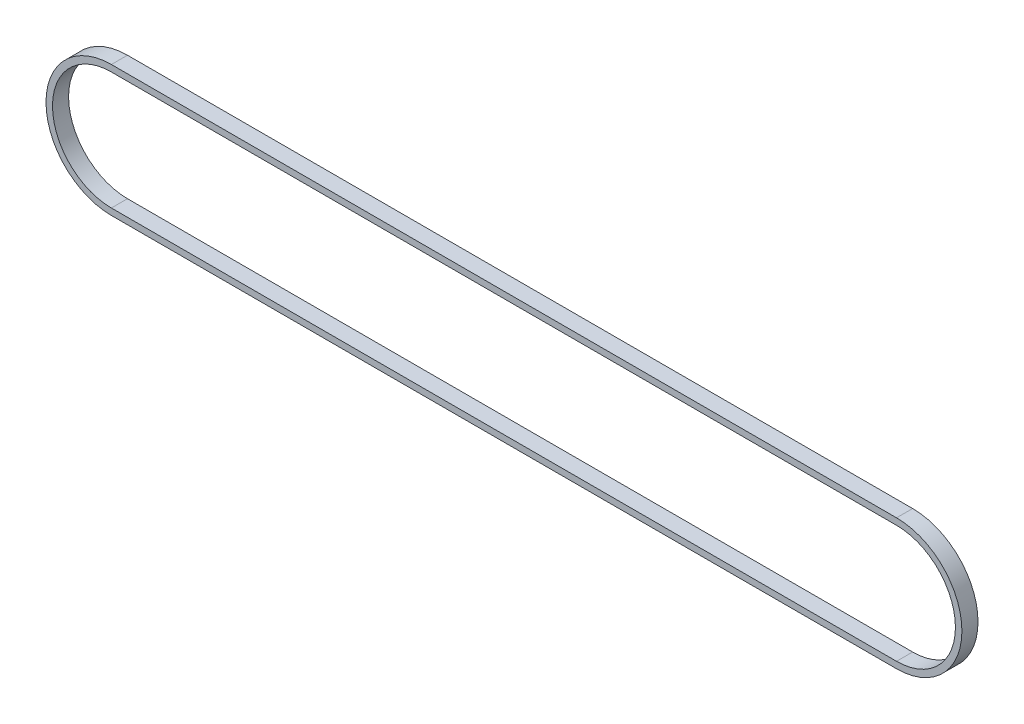
ISO-10303-21;
HEADER;
FILE_DESCRIPTION(('STEP AP214'),'2;1');
FILE_NAME('part.step','',(''),(''),'','','');
FILE_SCHEMA(('AUTOMOTIVE_DESIGN { 1 0 10303 214 1 1 1 1 }'));
ENDSEC;
DATA;
#1=APPLICATION_CONTEXT('core data for automotive mechanical design processes');
#2=APPLICATION_PROTOCOL_DEFINITION('international standard','automotive_design',2000,#1);
#3=PRODUCT_CONTEXT('',#1,'mechanical');
#4=PRODUCT('Part','Part','',(#3));
#5=PRODUCT_RELATED_PRODUCT_CATEGORY('part','',(#4));
#6=PRODUCT_DEFINITION_FORMATION('','',#4);
#7=PRODUCT_DEFINITION_CONTEXT('part definition',#1,'design');
#8=PRODUCT_DEFINITION('design','',#6,#7);
#9=PRODUCT_DEFINITION_SHAPE('','',#8);
#10=(LENGTH_UNIT() NAMED_UNIT(*) SI_UNIT(.MILLI.,.METRE.));
#11=(NAMED_UNIT(*) PLANE_ANGLE_UNIT() SI_UNIT($,.RADIAN.));
#12=(NAMED_UNIT(*) SI_UNIT($,.STERADIAN.) SOLID_ANGLE_UNIT());
#13=UNCERTAINTY_MEASURE_WITH_UNIT(LENGTH_MEASURE(1.E-05),#10,'distance_accuracy_value','');
#14=(GEOMETRIC_REPRESENTATION_CONTEXT(3) GLOBAL_UNCERTAINTY_ASSIGNED_CONTEXT((#13)) GLOBAL_UNIT_ASSIGNED_CONTEXT((#10,
#11,#12)) REPRESENTATION_CONTEXT('',''));
#15=CARTESIAN_POINT('',(0.,0.,0.));
#16=DIRECTION('',(0.,0.,1.));
#17=DIRECTION('',(1.,0.,0.));
#18=AXIS2_PLACEMENT_3D('',#15,#16,#17);
#19=CARTESIAN_POINT('',(8362.99467657725,-214.725030648158,82.));
#20=DIRECTION('',(0.,0.,1.));
#21=DIRECTION('',(1.,0.,0.));
#22=AXIS2_PLACEMENT_3D('',#19,#20,#21);
#23=PLANE('',#22);
#24=CARTESIAN_POINT('',(8362.99467657725,-214.725030648158,82.));
#25=DIRECTION('',(0.,0.,1.));
#26=DIRECTION('',(1.,0.,0.));
#27=AXIS2_PLACEMENT_3D('',#24,#25,#26);
#28=CIRCLE('',#27,333.06401102603);
#29=CARTESIAN_POINT('',(8362.99467657725,-547.789041674188,82.));
#30=VERTEX_POINT('',#29);
#31=CARTESIAN_POINT('',(8362.99467657725,118.338980377872,82.));
#32=VERTEX_POINT('',#31);
#33=EDGE_CURVE('E134',#30,#32,#28,.T.);
#34=ORIENTED_EDGE('',*,*,#33,.T.);
#35=DIRECTION('',(-1.,0.,0.));
#36=VECTOR('',#35,1.);
#37=CARTESIAN_POINT('',(8362.99467657725,118.338980377872,82.));
#38=LINE('',#37,#36);
#39=CARTESIAN_POINT('',(4362.99467657725,118.338980377871,82.));
#40=VERTEX_POINT('',#39);
#41=EDGE_CURVE('E137',#32,#40,#38,.T.);
#42=ORIENTED_EDGE('',*,*,#41,.T.);
#43=CARTESIAN_POINT('',(4362.99467657725,-214.725030648158,82.));
#44=DIRECTION('',(0.,0.,1.));
#45=DIRECTION('',(1.,0.,0.));
#46=AXIS2_PLACEMENT_3D('',#43,#44,#45);
#47=CIRCLE('',#46,333.064011026029);
#48=CARTESIAN_POINT('',(4362.99467657725,-547.789041674187,82.));
#49=VERTEX_POINT('',#48);
#50=EDGE_CURVE('E140',#40,#49,#47,.T.);
#51=ORIENTED_EDGE('',*,*,#50,.T.);
#52=DIRECTION('',(1.,0.,0.));
#53=VECTOR('',#52,1.);
#54=CARTESIAN_POINT('',(8362.99467657725,-547.789041674188,82.));
#55=LINE('',#54,#53);
#56=EDGE_CURVE('E142',#49,#30,#55,.T.);
#57=ORIENTED_EDGE('',*,*,#56,.T.);
#58=EDGE_LOOP('',(#34,#42,#51,#57));
#59=FACE_BOUND('',#58,.T.);
#60=DIRECTION('',(1.,0.,0.));
#61=VECTOR('',#60,1.);
#62=CARTESIAN_POINT('',(4362.99467657725,-514.725030648158,82.));
#63=LINE('',#62,#61);
#64=CARTESIAN_POINT('',(4362.99467657725,-514.725030648158,82.));
#65=VERTEX_POINT('',#64);
#66=CARTESIAN_POINT('',(8362.99467657725,-514.725030648158,82.));
#67=VERTEX_POINT('',#66);
#68=EDGE_CURVE('E106',#65,#67,#63,.T.);
#69=ORIENTED_EDGE('',*,*,#68,.F.);
#70=CARTESIAN_POINT('',(4362.99467657725,-214.725030648158,82.));
#71=DIRECTION('',(0.,0.,1.));
#72=DIRECTION('',(1.,0.,0.));
#73=AXIS2_PLACEMENT_3D('',#70,#71,#72);
#74=CIRCLE('',#73,300.);
#75=CARTESIAN_POINT('',(4362.99467657725,85.2749693518419,82.));
#76=VERTEX_POINT('',#75);
#77=EDGE_CURVE('E98',#76,#65,#74,.T.);
#78=ORIENTED_EDGE('',*,*,#77,.F.);
#79=DIRECTION('',(-1.,0.,0.));
#80=VECTOR('',#79,1.);
#81=CARTESIAN_POINT('',(4362.99467657725,85.2749693518419,82.));
#82=LINE('',#81,#80);
#83=CARTESIAN_POINT('',(8362.99467657725,85.2749693518419,82.));
#84=VERTEX_POINT('',#83);
#85=EDGE_CURVE('E120',#84,#76,#82,.T.);
#86=ORIENTED_EDGE('',*,*,#85,.F.);
#87=CARTESIAN_POINT('',(8362.99467657725,-214.725030648158,82.));
#88=DIRECTION('',(0.,0.,1.));
#89=DIRECTION('',(1.,0.,0.));
#90=AXIS2_PLACEMENT_3D('',#87,#88,#89);
#91=CIRCLE('',#90,300.);
#92=EDGE_CURVE('E118',#67,#84,#91,.T.);
#93=ORIENTED_EDGE('',*,*,#92,.F.);
#94=EDGE_LOOP('',(#69,#78,#86,#93));
#95=FACE_BOUND('',#94,.T.);
#96=ADVANCED_FACE('F33',(#59,#95),#23,.T.);
#97=CARTESIAN_POINT('',(8362.99467657725,-214.725030648158,0.));
#98=DIRECTION('',(0.,0.,1.));
#99=DIRECTION('',(1.,0.,0.));
#100=AXIS2_PLACEMENT_3D('',#97,#98,#99);
#101=PLANE('',#100);
#102=CARTESIAN_POINT('',(8362.99467657725,-214.725030648158,0.));
#103=DIRECTION('',(0.,0.,1.));
#104=DIRECTION('',(1.,0.,0.));
#105=AXIS2_PLACEMENT_3D('',#102,#103,#104);
#106=CIRCLE('',#105,333.06401102603);
#107=CARTESIAN_POINT('',(8362.99467657725,-547.789041674188,0.));
#108=VERTEX_POINT('',#107);
#109=CARTESIAN_POINT('',(8362.99467657725,118.338980377872,0.));
#110=VERTEX_POINT('',#109);
#111=EDGE_CURVE('E114',#108,#110,#106,.T.);
#112=ORIENTED_EDGE('',*,*,#111,.F.);
#113=DIRECTION('',(1.,0.,0.));
#114=VECTOR('',#113,1.);
#115=CARTESIAN_POINT('',(8362.99467657725,-547.789041674188,0.));
#116=LINE('',#115,#114);
#117=CARTESIAN_POINT('',(4362.99467657725,-547.789041674187,0.));
#118=VERTEX_POINT('',#117);
#119=EDGE_CURVE('E138',#118,#108,#116,.T.);
#120=ORIENTED_EDGE('',*,*,#119,.F.);
#121=CARTESIAN_POINT('',(4362.99467657725,-214.725030648158,0.));
#122=DIRECTION('',(0.,0.,1.));
#123=DIRECTION('',(1.,0.,0.));
#124=AXIS2_PLACEMENT_3D('',#121,#122,#123);
#125=CIRCLE('',#124,333.064011026029);
#126=CARTESIAN_POINT('',(4362.99467657725,118.338980377871,0.));
#127=VERTEX_POINT('',#126);
#128=EDGE_CURVE('E149',#127,#118,#125,.T.);
#129=ORIENTED_EDGE('',*,*,#128,.F.);
#130=DIRECTION('',(-1.,0.,0.));
#131=VECTOR('',#130,1.);
#132=CARTESIAN_POINT('',(8362.99467657725,118.338980377872,0.));
#133=LINE('',#132,#131);
#134=EDGE_CURVE('E147',#110,#127,#133,.T.);
#135=ORIENTED_EDGE('',*,*,#134,.F.);
#136=EDGE_LOOP('',(#112,#120,#129,#135));
#137=FACE_BOUND('',#136,.T.);
#138=CARTESIAN_POINT('',(4362.99467657725,-214.725030648158,0.));
#139=DIRECTION('',(0.,0.,1.));
#140=DIRECTION('',(1.,0.,0.));
#141=AXIS2_PLACEMENT_3D('',#138,#139,#140);
#142=CIRCLE('',#141,300.);
#143=CARTESIAN_POINT('',(4362.99467657725,85.2749693518419,0.));
#144=VERTEX_POINT('',#143);
#145=CARTESIAN_POINT('',(4362.99467657725,-514.725030648158,0.));
#146=VERTEX_POINT('',#145);
#147=EDGE_CURVE('E56',#144,#146,#142,.T.);
#148=ORIENTED_EDGE('',*,*,#147,.T.);
#149=DIRECTION('',(1.,0.,0.));
#150=VECTOR('',#149,1.);
#151=CARTESIAN_POINT('',(4362.99467657725,-514.725030648158,0.));
#152=LINE('',#151,#150);
#153=CARTESIAN_POINT('',(8362.99467657725,-514.725030648158,0.));
#154=VERTEX_POINT('',#153);
#155=EDGE_CURVE('E113',#146,#154,#152,.T.);
#156=ORIENTED_EDGE('',*,*,#155,.T.);
#157=CARTESIAN_POINT('',(8362.99467657725,-214.725030648158,0.));
#158=DIRECTION('',(0.,0.,1.));
#159=DIRECTION('',(1.,0.,0.));
#160=AXIS2_PLACEMENT_3D('',#157,#158,#159);
#161=CIRCLE('',#160,300.);
#162=CARTESIAN_POINT('',(8362.99467657725,85.2749693518419,0.));
#163=VERTEX_POINT('',#162);
#164=EDGE_CURVE('E126',#154,#163,#161,.T.);
#165=ORIENTED_EDGE('',*,*,#164,.T.);
#166=DIRECTION('',(-1.,0.,0.));
#167=VECTOR('',#166,1.);
#168=CARTESIAN_POINT('',(4362.99467657725,85.2749693518419,0.));
#169=LINE('',#168,#167);
#170=EDGE_CURVE('E107',#163,#144,#169,.T.);
#171=ORIENTED_EDGE('',*,*,#170,.T.);
#172=EDGE_LOOP('',(#148,#156,#165,#171));
#173=FACE_BOUND('',#172,.T.);
#174=ADVANCED_FACE('F167',(#137,#173),#101,.F.);
#175=CARTESIAN_POINT('',(8362.99467657725,-214.725030648158,82.));
#176=DIRECTION('',(0.,0.,-1.));
#177=DIRECTION('',(-1.,0.,0.));
#178=AXIS2_PLACEMENT_3D('',#175,#176,#177);
#179=CYLINDRICAL_SURFACE('',#178,333.06401102603);
#180=ORIENTED_EDGE('',*,*,#111,.T.);
#181=DIRECTION('',(0.,0.,-1.));
#182=VECTOR('',#181,1.);
#183=CARTESIAN_POINT('',(8362.99467657725,118.338980377872,82.));
#184=LINE('',#183,#182);
#185=EDGE_CURVE('E11',#32,#110,#184,.T.);
#186=ORIENTED_EDGE('',*,*,#185,.F.);
#187=ORIENTED_EDGE('',*,*,#33,.F.);
#188=DIRECTION('',(0.,0.,-1.));
#189=VECTOR('',#188,1.);
#190=CARTESIAN_POINT('',(8362.99467657725,-547.789041674188,82.));
#191=LINE('',#190,#189);
#192=EDGE_CURVE('E144',#30,#108,#191,.T.);
#193=ORIENTED_EDGE('',*,*,#192,.T.);
#194=EDGE_LOOP('',(#180,#186,#187,#193));
#195=FACE_BOUND('',#194,.T.);
#196=ADVANCED_FACE('F35',(#195),#179,.T.);
#197=CARTESIAN_POINT('',(8362.99467657725,118.338980377872,82.));
#198=DIRECTION('',(0.,-1.,0.));
#199=DIRECTION('',(1.,0.,0.));
#200=AXIS2_PLACEMENT_3D('',#197,#198,#199);
#201=PLANE('',#200);
#202=ORIENTED_EDGE('',*,*,#134,.T.);
#203=DIRECTION('',(0.,0.,-1.));
#204=VECTOR('',#203,1.);
#205=CARTESIAN_POINT('',(4362.99467657725,118.338980377871,82.));
#206=LINE('',#205,#204);
#207=EDGE_CURVE('E41',#40,#127,#206,.T.);
#208=ORIENTED_EDGE('',*,*,#207,.F.);
#209=ORIENTED_EDGE('',*,*,#41,.F.);
#210=ORIENTED_EDGE('',*,*,#185,.T.);
#211=EDGE_LOOP('',(#202,#208,#209,#210));
#212=FACE_BOUND('',#211,.T.);
#213=ADVANCED_FACE('F177',(#212),#201,.F.);
#214=CARTESIAN_POINT('',(4362.99467657725,-214.725030648158,82.));
#215=DIRECTION('',(0.,0.,-1.));
#216=DIRECTION('',(-1.,0.,0.));
#217=AXIS2_PLACEMENT_3D('',#214,#215,#216);
#218=CYLINDRICAL_SURFACE('',#217,333.064011026029);
#219=ORIENTED_EDGE('',*,*,#128,.T.);
#220=DIRECTION('',(0.,0.,-1.));
#221=VECTOR('',#220,1.);
#222=CARTESIAN_POINT('',(4362.99467657725,-547.789041674187,82.));
#223=LINE('',#222,#221);
#224=EDGE_CURVE('E154',#49,#118,#223,.T.);
#225=ORIENTED_EDGE('',*,*,#224,.F.);
#226=ORIENTED_EDGE('',*,*,#50,.F.);
#227=ORIENTED_EDGE('',*,*,#207,.T.);
#228=EDGE_LOOP('',(#219,#225,#226,#227));
#229=FACE_BOUND('',#228,.T.);
#230=ADVANCED_FACE('F161',(#229),#218,.T.);
#231=CARTESIAN_POINT('',(8362.99467657725,-547.789041674188,82.));
#232=DIRECTION('',(0.,1.,0.));
#233=DIRECTION('',(-1.,0.,0.));
#234=AXIS2_PLACEMENT_3D('',#231,#232,#233);
#235=PLANE('',#234);
#236=ORIENTED_EDGE('',*,*,#119,.T.);
#237=ORIENTED_EDGE('',*,*,#192,.F.);
#238=ORIENTED_EDGE('',*,*,#56,.F.);
#239=ORIENTED_EDGE('',*,*,#224,.T.);
#240=EDGE_LOOP('',(#236,#237,#238,#239));
#241=FACE_BOUND('',#240,.T.);
#242=ADVANCED_FACE('F171',(#241),#235,.F.);
#243=CARTESIAN_POINT('',(4362.99467657725,-214.725030648158,82.));
#244=DIRECTION('',(0.,0.,-1.));
#245=DIRECTION('',(-1.,0.,0.));
#246=AXIS2_PLACEMENT_3D('',#243,#244,#245);
#247=CYLINDRICAL_SURFACE('',#246,300.);
#248=ORIENTED_EDGE('',*,*,#147,.F.);
#249=DIRECTION('',(0.,0.,-1.));
#250=VECTOR('',#249,1.);
#251=CARTESIAN_POINT('',(4362.99467657725,85.2749693518419,82.));
#252=LINE('',#251,#250);
#253=EDGE_CURVE('E102',#76,#144,#252,.T.);
#254=ORIENTED_EDGE('',*,*,#253,.F.);
#255=ORIENTED_EDGE('',*,*,#77,.T.);
#256=DIRECTION('',(0.,0.,-1.));
#257=VECTOR('',#256,1.);
#258=CARTESIAN_POINT('',(4362.99467657725,-514.725030648158,82.));
#259=LINE('',#258,#257);
#260=EDGE_CURVE('E101',#65,#146,#259,.T.);
#261=ORIENTED_EDGE('',*,*,#260,.T.);
#262=EDGE_LOOP('',(#248,#254,#255,#261));
#263=FACE_BOUND('',#262,.T.);
#264=ADVANCED_FACE('F100',(#263),#247,.F.);
#265=CARTESIAN_POINT('',(4362.99467657725,-514.725030648158,82.));
#266=DIRECTION('',(0.,1.,0.));
#267=DIRECTION('',(0.,0.,1.));
#268=AXIS2_PLACEMENT_3D('',#265,#266,#267);
#269=PLANE('',#268);
#270=ORIENTED_EDGE('',*,*,#155,.F.);
#271=ORIENTED_EDGE('',*,*,#260,.F.);
#272=ORIENTED_EDGE('',*,*,#68,.T.);
#273=DIRECTION('',(0.,0.,-1.));
#274=VECTOR('',#273,1.);
#275=CARTESIAN_POINT('',(8362.99467657725,-514.725030648158,82.));
#276=LINE('',#275,#274);
#277=EDGE_CURVE('E115',#67,#154,#276,.T.);
#278=ORIENTED_EDGE('',*,*,#277,.T.);
#279=EDGE_LOOP('',(#270,#271,#272,#278));
#280=FACE_BOUND('',#279,.T.);
#281=ADVANCED_FACE('F110',(#280),#269,.T.);
#282=CARTESIAN_POINT('',(8362.99467657725,-214.725030648158,82.));
#283=DIRECTION('',(0.,0.,-1.));
#284=DIRECTION('',(-1.,0.,0.));
#285=AXIS2_PLACEMENT_3D('',#282,#283,#284);
#286=CYLINDRICAL_SURFACE('',#285,300.);
#287=ORIENTED_EDGE('',*,*,#164,.F.);
#288=ORIENTED_EDGE('',*,*,#277,.F.);
#289=ORIENTED_EDGE('',*,*,#92,.T.);
#290=DIRECTION('',(0.,0.,-1.));
#291=VECTOR('',#290,1.);
#292=CARTESIAN_POINT('',(8362.99467657725,85.2749693518419,82.));
#293=LINE('',#292,#291);
#294=EDGE_CURVE('E48',#84,#163,#293,.T.);
#295=ORIENTED_EDGE('',*,*,#294,.T.);
#296=EDGE_LOOP('',(#287,#288,#289,#295));
#297=FACE_BOUND('',#296,.T.);
#298=ADVANCED_FACE('F200',(#297),#286,.F.);
#299=CARTESIAN_POINT('',(4362.99467657725,85.2749693518419,82.));
#300=DIRECTION('',(0.,-1.,0.));
#301=DIRECTION('',(0.,0.,-1.));
#302=AXIS2_PLACEMENT_3D('',#299,#300,#301);
#303=PLANE('',#302);
#304=ORIENTED_EDGE('',*,*,#170,.F.);
#305=ORIENTED_EDGE('',*,*,#294,.F.);
#306=ORIENTED_EDGE('',*,*,#85,.T.);
#307=ORIENTED_EDGE('',*,*,#253,.T.);
#308=EDGE_LOOP('',(#304,#305,#306,#307));
#309=FACE_BOUND('',#308,.T.);
#310=ADVANCED_FACE('F204',(#309),#303,.T.);
#311=CLOSED_SHELL('',(#96,#174,#196,#213,#230,#242,#264,#281,#298,#310));
#312=MANIFOLD_SOLID_BREP('B2',#311);
#313=ADVANCED_BREP_SHAPE_REPRESENTATION('',(#18,#312),#14);
#314=SHAPE_DEFINITION_REPRESENTATION(#9,#313);
ENDSEC;
END-ISO-10303-21;
